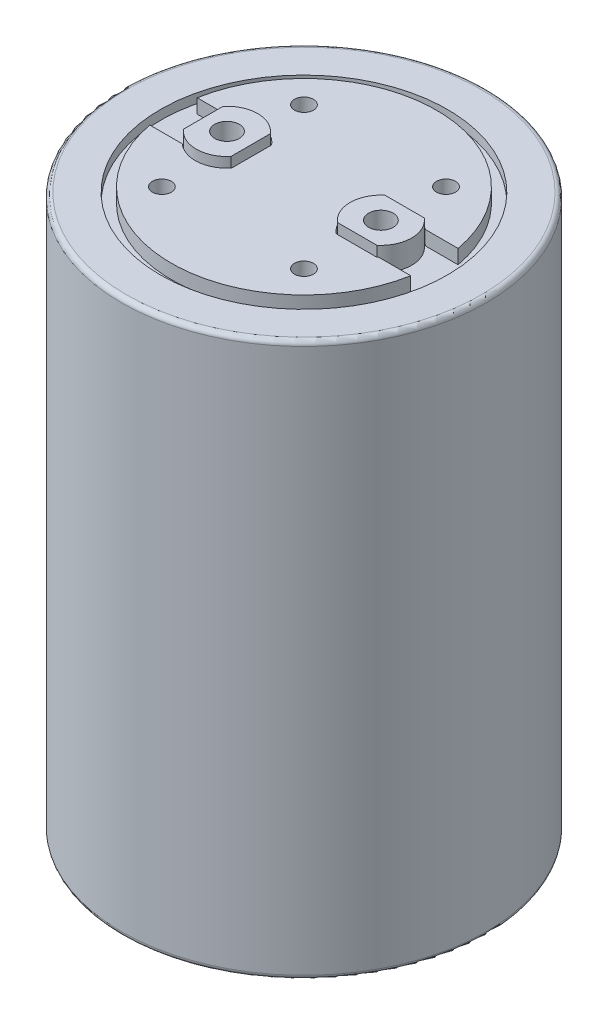
ISO-10303-21;
HEADER;
FILE_DESCRIPTION(('STEP AP214'),'2;1');
FILE_NAME('part.step','',(''),(''),'','','');
FILE_SCHEMA(('AUTOMOTIVE_DESIGN { 1 0 10303 214 1 1 1 1 }'));
ENDSEC;
DATA;
#1=APPLICATION_CONTEXT('core data for automotive mechanical design processes');
#2=APPLICATION_PROTOCOL_DEFINITION('international standard','automotive_design',2000,#1);
#3=PRODUCT_CONTEXT('',#1,'mechanical');
#4=PRODUCT('Part','Part','',(#3));
#5=PRODUCT_RELATED_PRODUCT_CATEGORY('part','',(#4));
#6=PRODUCT_DEFINITION_FORMATION('','',#4);
#7=PRODUCT_DEFINITION_CONTEXT('part definition',#1,'design');
#8=PRODUCT_DEFINITION('design','',#6,#7);
#9=PRODUCT_DEFINITION_SHAPE('','',#8);
#10=(LENGTH_UNIT() NAMED_UNIT(*) SI_UNIT(.MILLI.,.METRE.));
#11=(NAMED_UNIT(*) PLANE_ANGLE_UNIT() SI_UNIT($,.RADIAN.));
#12=(NAMED_UNIT(*) SI_UNIT($,.STERADIAN.) SOLID_ANGLE_UNIT());
#13=UNCERTAINTY_MEASURE_WITH_UNIT(LENGTH_MEASURE(1.E-05),#10,'distance_accuracy_value','');
#14=(GEOMETRIC_REPRESENTATION_CONTEXT(3) GLOBAL_UNCERTAINTY_ASSIGNED_CONTEXT((#13)) GLOBAL_UNIT_ASSIGNED_CONTEXT((#10,
#11,#12)) REPRESENTATION_CONTEXT('',''));
#15=CARTESIAN_POINT('',(0.,0.,0.));
#16=DIRECTION('',(0.,0.,1.));
#17=DIRECTION('',(1.,0.,0.));
#18=AXIS2_PLACEMENT_3D('',#15,#16,#17);
#19=CARTESIAN_POINT('',(1.1478244810946,61.4471649497469,37.8154701534106));
#20=DIRECTION('',(0.,-1.,0.));
#21=DIRECTION('',(0.,0.,-1.));
#22=AXIS2_PLACEMENT_3D('',#19,#20,#21);
#23=CYLINDRICAL_SURFACE('',#22,28.);
#24=CARTESIAN_POINT('',(1.1478244810946,58.4471649497469,37.8154701534106));
#25=DIRECTION('',(0.,1.,0.));
#26=DIRECTION('',(0.,0.,1.));
#27=AXIS2_PLACEMENT_3D('',#24,#25,#26);
#28=CIRCLE('',#27,28.);
#29=CARTESIAN_POINT('',(28.6977791090064,58.4471649497469,32.8154701534106));
#30=VERTEX_POINT('',#29);
#31=CARTESIAN_POINT('',(-26.4021301468172,58.4471649497469,32.8154701534106));
#32=VERTEX_POINT('',#31);
#33=EDGE_CURVE('E255',#30,#32,#28,.T.);
#34=ORIENTED_EDGE('',*,*,#33,.T.);
#35=DIRECTION('',(0.,-1.,0.));
#36=VECTOR('',#35,1.);
#37=CARTESIAN_POINT('',(-26.4021301468172,61.4471649497469,32.8154701534106));
#38=LINE('',#37,#36);
#39=CARTESIAN_POINT('',(-26.4021301468172,61.4471649497469,32.8154701534106));
#40=VERTEX_POINT('',#39);
#41=EDGE_CURVE('E181',#32,#40,#38,.F.);
#42=ORIENTED_EDGE('',*,*,#41,.T.);
#43=CARTESIAN_POINT('',(1.1478244810946,61.4471649497469,37.8154701534106));
#44=DIRECTION('',(0.,1.,0.));
#45=DIRECTION('',(0.,0.,1.));
#46=AXIS2_PLACEMENT_3D('',#43,#44,#45);
#47=CIRCLE('',#46,28.);
#48=CARTESIAN_POINT('',(28.6977791090064,61.4471649497469,32.8154701534106));
#49=VERTEX_POINT('',#48);
#50=EDGE_CURVE('E254',#49,#40,#47,.T.);
#51=ORIENTED_EDGE('',*,*,#50,.F.);
#52=DIRECTION('',(0.,-1.,0.));
#53=VECTOR('',#52,1.);
#54=CARTESIAN_POINT('',(28.6977791090064,61.4471649497469,32.8154701534106));
#55=LINE('',#54,#53);
#56=EDGE_CURVE('E293',#49,#30,#55,.T.);
#57=ORIENTED_EDGE('',*,*,#56,.T.);
#58=EDGE_LOOP('',(#34,#42,#51,#57));
#59=FACE_BOUND('',#58,.T.);
#60=ADVANCED_FACE('F47',(#59),#23,.T.);
#61=CARTESIAN_POINT('',(17.3978244810946,61.4471649497469,37.8154701534106));
#62=DIRECTION('',(0.,-1.,0.));
#63=DIRECTION('',(0.,0.,-1.));
#64=AXIS2_PLACEMENT_3D('',#61,#62,#63);
#65=CYLINDRICAL_SURFACE('',#64,6.7);
#66=DIRECTION('',(0.,-1.,0.));
#67=VECTOR('',#66,1.);
#68=CARTESIAN_POINT('',(21.8576451052902,61.4471649497469,42.8154701534106));
#69=LINE('',#68,#67);
#70=CARTESIAN_POINT('',(21.8576451052902,58.4471649497469,42.8154701534106));
#71=VERTEX_POINT('',#70);
#72=CARTESIAN_POINT('',(21.8576451052902,61.4471649497469,42.8154701534106));
#73=VERTEX_POINT('',#72);
#74=EDGE_CURVE('E146',#71,#73,#69,.F.);
#75=ORIENTED_EDGE('',*,*,#74,.F.);
#76=CARTESIAN_POINT('',(17.3978244810946,58.4471649497469,37.8154701534106));
#77=DIRECTION('',(0.,1.,0.));
#78=DIRECTION('',(0.,0.,1.));
#79=AXIS2_PLACEMENT_3D('',#76,#77,#78);
#80=CIRCLE('',#79,6.7);
#81=CARTESIAN_POINT('',(21.6227505159501,58.4471649497469,43.0154701534106));
#82=VERTEX_POINT('',#81);
#83=EDGE_CURVE('E188',#82,#71,#80,.T.);
#84=ORIENTED_EDGE('',*,*,#83,.F.);
#85=DIRECTION('',(0.,-1.,0.));
#86=VECTOR('',#85,1.);
#87=CARTESIAN_POINT('',(21.6227505159501,61.4471649497469,43.0154701534106));
#88=LINE('',#87,#86);
#89=CARTESIAN_POINT('',(21.6227505159501,61.4471649497469,43.0154701534106));
#90=VERTEX_POINT('',#89);
#91=EDGE_CURVE('E173',#90,#82,#88,.T.);
#92=ORIENTED_EDGE('',*,*,#91,.F.);
#93=CARTESIAN_POINT('',(17.3978244810946,61.4471649497469,37.8154701534106));
#94=DIRECTION('',(0.,1.,0.));
#95=DIRECTION('',(0.,0.,1.));
#96=AXIS2_PLACEMENT_3D('',#93,#94,#95);
#97=CIRCLE('',#96,6.7);
#98=EDGE_CURVE('E165',#90,#73,#97,.T.);
#99=ORIENTED_EDGE('',*,*,#98,.T.);
#100=EDGE_LOOP('',(#75,#84,#92,#99));
#101=FACE_BOUND('',#100,.T.);
#102=ADVANCED_FACE('F171',(#101),#65,.F.);
#103=CARTESIAN_POINT('',(1.1478244810946,61.4471649497469,37.8154701534106));
#104=DIRECTION('',(0.,1.,0.));
#105=DIRECTION('',(0.,0.,1.));
#106=AXIS2_PLACEMENT_3D('',#103,#104,#105);
#107=PLANE('',#106);
#108=DIRECTION('',(-1.,0.,0.));
#109=VECTOR('',#108,1.);
#110=CARTESIAN_POINT('',(-26.8521755189054,61.4471649497469,32.8154701534106));
#111=LINE('',#110,#109);
#112=CARTESIAN_POINT('',(-19.5619961431009,61.4471649497469,32.8154701534106));
#113=VERTEX_POINT('',#112);
#114=EDGE_CURVE('E285',#113,#40,#111,.T.);
#115=ORIENTED_EDGE('',*,*,#114,.F.);
#116=CARTESIAN_POINT('',(-15.1021755189054,61.4471649497469,37.8154701534106));
#117=DIRECTION('',(0.,1.,0.));
#118=DIRECTION('',(0.,0.,1.));
#119=AXIS2_PLACEMENT_3D('',#116,#117,#118);
#120=CIRCLE('',#119,6.69999999999999);
#121=CARTESIAN_POINT('',(-9.9021755189054,61.4471649497469,33.5905441185551));
#122=VERTEX_POINT('',#121);
#123=EDGE_CURVE('E208',#122,#113,#120,.T.);
#124=ORIENTED_EDGE('',*,*,#123,.F.);
#125=DIRECTION('',(0.,0.,-1.));
#126=VECTOR('',#125,1.);
#127=CARTESIAN_POINT('',(-9.9021755189054,61.4471649497469,42.0403961882661));
#128=LINE('',#127,#126);
#129=CARTESIAN_POINT('',(-9.9021755189054,61.4471649497469,42.0403961882661));
#130=VERTEX_POINT('',#129);
#131=EDGE_CURVE('E214',#130,#122,#128,.T.);
#132=ORIENTED_EDGE('',*,*,#131,.F.);
#133=CARTESIAN_POINT('',(-15.1021755189054,61.4471649497469,37.8154701534106));
#134=DIRECTION('',(0.,1.,0.));
#135=DIRECTION('',(0.,0.,1.));
#136=AXIS2_PLACEMENT_3D('',#133,#134,#135);
#137=CIRCLE('',#136,6.7);
#138=CARTESIAN_POINT('',(-19.561996143101,61.4471649497469,42.8154701534106));
#139=VERTEX_POINT('',#138);
#140=EDGE_CURVE('E211',#139,#130,#137,.T.);
#141=ORIENTED_EDGE('',*,*,#140,.F.);
#142=DIRECTION('',(1.,0.,0.));
#143=VECTOR('',#142,1.);
#144=CARTESIAN_POINT('',(-15.1021755189054,61.4471649497469,42.8154701534106));
#145=LINE('',#144,#143);
#146=CARTESIAN_POINT('',(-26.4021301468172,61.4471649497469,42.8154701534106));
#147=VERTEX_POINT('',#146);
#148=EDGE_CURVE('E69',#147,#139,#145,.T.);
#149=ORIENTED_EDGE('',*,*,#148,.F.);
#150=CARTESIAN_POINT('',(28.6977791090064,61.4471649497469,42.8154701534106));
#151=VERTEX_POINT('',#150);
#152=EDGE_CURVE('E167',#147,#151,#47,.T.);
#153=ORIENTED_EDGE('',*,*,#152,.T.);
#154=DIRECTION('',(1.,0.,0.));
#155=VECTOR('',#154,1.);
#156=CARTESIAN_POINT('',(29.1478244810946,61.4471649497469,42.8154701534106));
#157=LINE('',#156,#155);
#158=EDGE_CURVE('E149',#73,#151,#157,.T.);
#159=ORIENTED_EDGE('',*,*,#158,.F.);
#160=ORIENTED_EDGE('',*,*,#98,.F.);
#161=DIRECTION('',(1.,0.,0.));
#162=VECTOR('',#161,1.);
#163=CARTESIAN_POINT('',(13.1728984462391,61.4471649497469,43.0154701534106));
#164=LINE('',#163,#162);
#165=CARTESIAN_POINT('',(13.1728984462391,61.4471649497469,43.0154701534106));
#166=VERTEX_POINT('',#165);
#167=EDGE_CURVE('E186',#166,#90,#164,.T.);
#168=ORIENTED_EDGE('',*,*,#167,.F.);
#169=CARTESIAN_POINT('',(17.3978244810946,61.4471649497469,37.8154701534106));
#170=DIRECTION('',(0.,1.,0.));
#171=DIRECTION('',(0.,0.,1.));
#172=AXIS2_PLACEMENT_3D('',#169,#170,#171);
#173=CIRCLE('',#172,6.70000000000001);
#174=CARTESIAN_POINT('',(13.1728984462391,61.4471649497469,32.6154701534106));
#175=VERTEX_POINT('',#174);
#176=EDGE_CURVE('E177',#175,#166,#173,.T.);
#177=ORIENTED_EDGE('',*,*,#176,.F.);
#178=DIRECTION('',(-1.,0.,0.));
#179=VECTOR('',#178,1.);
#180=CARTESIAN_POINT('',(21.6227505159501,61.4471649497469,32.6154701534106));
#181=LINE('',#180,#179);
#182=CARTESIAN_POINT('',(21.6227505159501,61.4471649497469,32.6154701534106));
#183=VERTEX_POINT('',#182);
#184=EDGE_CURVE('E174',#183,#175,#181,.T.);
#185=ORIENTED_EDGE('',*,*,#184,.F.);
#186=CARTESIAN_POINT('',(21.8576451052902,61.4471649497469,32.8154701534106));
#187=VERTEX_POINT('',#186);
#188=EDGE_CURVE('E175',#187,#183,#97,.T.);
#189=ORIENTED_EDGE('',*,*,#188,.F.);
#190=DIRECTION('',(-1.,0.,0.));
#191=VECTOR('',#190,1.);
#192=CARTESIAN_POINT('',(17.3978244810946,61.4471649497469,32.8154701534106));
#193=LINE('',#192,#191);
#194=EDGE_CURVE('E168',#49,#187,#193,.T.);
#195=ORIENTED_EDGE('',*,*,#194,.F.);
#196=ORIENTED_EDGE('',*,*,#50,.T.);
#197=EDGE_LOOP('',(#115,#124,#132,#141,#149,#153,#159,#160,#168,#177,#185,#189,#195,#196));
#198=FACE_BOUND('',#197,.T.);
#199=CARTESIAN_POINT('',(16.1478244810946,61.4471649497469,22.8154701534106));
#200=DIRECTION('',(0.,1.,0.));
#201=DIRECTION('',(0.,0.,1.));
#202=AXIS2_PLACEMENT_3D('',#199,#200,#201);
#203=CIRCLE('',#202,2.);
#204=CARTESIAN_POINT('',(16.1478244810946,61.4471649497469,24.8154701534106));
#205=VERTEX_POINT('',#204);
#206=EDGE_CURVE('E235',#205,#205,#203,.T.);
#207=ORIENTED_EDGE('',*,*,#206,.F.);
#208=EDGE_LOOP('',(#207));
#209=FACE_BOUND('',#208,.T.);
#210=CARTESIAN_POINT('',(-13.8521755189054,61.4471649497469,22.8154701534106));
#211=DIRECTION('',(0.,1.,0.));
#212=DIRECTION('',(0.,0.,-1.));
#213=AXIS2_PLACEMENT_3D('',#210,#211,#212);
#214=CIRCLE('',#213,2.);
#215=CARTESIAN_POINT('',(-13.8521755189054,61.4471649497469,20.8154701534106));
#216=VERTEX_POINT('',#215);
#217=EDGE_CURVE('E247',#216,#216,#214,.T.);
#218=ORIENTED_EDGE('',*,*,#217,.F.);
#219=EDGE_LOOP('',(#218));
#220=FACE_BOUND('',#219,.T.);
#221=CARTESIAN_POINT('',(16.1478244810946,61.4471649497469,52.8154701534106));
#222=DIRECTION('',(0.,1.,0.));
#223=DIRECTION('',(0.,0.,1.));
#224=AXIS2_PLACEMENT_3D('',#221,#222,#223);
#225=CIRCLE('',#224,2.);
#226=CARTESIAN_POINT('',(16.1478244810946,61.4471649497469,54.8154701534106));
#227=VERTEX_POINT('',#226);
#228=EDGE_CURVE('E241',#227,#227,#225,.T.);
#229=ORIENTED_EDGE('',*,*,#228,.F.);
#230=EDGE_LOOP('',(#229));
#231=FACE_BOUND('',#230,.T.);
#232=CARTESIAN_POINT('',(-13.8521755189054,61.4471649497469,52.8154701534106));
#233=DIRECTION('',(0.,1.,0.));
#234=DIRECTION('',(0.,0.,-1.));
#235=AXIS2_PLACEMENT_3D('',#232,#233,#234);
#236=CIRCLE('',#235,2.);
#237=CARTESIAN_POINT('',(-13.8521755189054,61.4471649497469,50.8154701534106));
#238=VERTEX_POINT('',#237);
#239=EDGE_CURVE('E229',#238,#238,#236,.T.);
#240=ORIENTED_EDGE('',*,*,#239,.F.);
#241=EDGE_LOOP('',(#240));
#242=FACE_BOUND('',#241,.T.);
#243=ADVANCED_FACE('F162',(#198,#209,#220,#231,#242),#107,.T.);
#244=CARTESIAN_POINT('',(1.1478244810946,58.4471649497469,37.8154701534106));
#245=DIRECTION('',(0.,1.,0.));
#246=DIRECTION('',(0.,0.,1.));
#247=AXIS2_PLACEMENT_3D('',#244,#245,#246);
#248=PLANE('',#247);
#249=CARTESIAN_POINT('',(-15.1021755189054,58.4471649497469,37.8154701534106));
#250=DIRECTION('',(0.,1.,0.));
#251=DIRECTION('',(0.,0.,1.));
#252=AXIS2_PLACEMENT_3D('',#249,#250,#251);
#253=CIRCLE('',#252,6.69999999999999);
#254=CARTESIAN_POINT('',(-9.9021755189054,58.4471649497469,33.5905441185551));
#255=VERTEX_POINT('',#254);
#256=CARTESIAN_POINT('',(-19.5619961431009,58.4471649497469,32.8154701534106));
#257=VERTEX_POINT('',#256);
#258=EDGE_CURVE('E207',#255,#257,#253,.T.);
#259=ORIENTED_EDGE('',*,*,#258,.T.);
#260=DIRECTION('',(-1.,0.,0.));
#261=VECTOR('',#260,1.);
#262=CARTESIAN_POINT('',(1.1478244810946,58.4471649497469,32.8154701534106));
#263=LINE('',#262,#261);
#264=EDGE_CURVE('E61',#257,#32,#263,.T.);
#265=ORIENTED_EDGE('',*,*,#264,.T.);
#266=ORIENTED_EDGE('',*,*,#33,.F.);
#267=DIRECTION('',(-1.,0.,0.));
#268=VECTOR('',#267,1.);
#269=CARTESIAN_POINT('',(1.1478244810946,58.4471649497469,32.8154701534106));
#270=LINE('',#269,#268);
#271=CARTESIAN_POINT('',(21.8576451052902,58.4471649497469,32.8154701534106));
#272=VERTEX_POINT('',#271);
#273=EDGE_CURVE('E290',#30,#272,#270,.T.);
#274=ORIENTED_EDGE('',*,*,#273,.T.);
#275=CARTESIAN_POINT('',(21.6227505159501,58.4471649497469,32.6154701534106));
#276=VERTEX_POINT('',#275);
#277=EDGE_CURVE('E191',#272,#276,#80,.T.);
#278=ORIENTED_EDGE('',*,*,#277,.T.);
#279=DIRECTION('',(-1.,0.,0.));
#280=VECTOR('',#279,1.);
#281=CARTESIAN_POINT('',(21.6227505159501,58.4471649497469,32.6154701534106));
#282=LINE('',#281,#280);
#283=CARTESIAN_POINT('',(13.1728984462391,58.4471649497469,32.6154701534106));
#284=VERTEX_POINT('',#283);
#285=EDGE_CURVE('E190',#276,#284,#282,.T.);
#286=ORIENTED_EDGE('',*,*,#285,.T.);
#287=CARTESIAN_POINT('',(17.3978244810946,58.4471649497469,37.8154701534106));
#288=DIRECTION('',(0.,1.,0.));
#289=DIRECTION('',(0.,0.,1.));
#290=AXIS2_PLACEMENT_3D('',#287,#288,#289);
#291=CIRCLE('',#290,6.70000000000001);
#292=CARTESIAN_POINT('',(13.1728984462391,58.4471649497469,43.0154701534106));
#293=VERTEX_POINT('',#292);
#294=EDGE_CURVE('E194',#284,#293,#291,.T.);
#295=ORIENTED_EDGE('',*,*,#294,.T.);
#296=DIRECTION('',(1.,0.,0.));
#297=VECTOR('',#296,1.);
#298=CARTESIAN_POINT('',(13.1728984462391,58.4471649497469,43.0154701534106));
#299=LINE('',#298,#297);
#300=EDGE_CURVE('E179',#293,#82,#299,.T.);
#301=ORIENTED_EDGE('',*,*,#300,.T.);
#302=ORIENTED_EDGE('',*,*,#83,.T.);
#303=DIRECTION('',(1.,0.,0.));
#304=VECTOR('',#303,1.);
#305=CARTESIAN_POINT('',(1.1478244810946,58.4471649497469,42.8154701534106));
#306=LINE('',#305,#304);
#307=CARTESIAN_POINT('',(28.6977791090064,58.4471649497469,42.8154701534106));
#308=VERTEX_POINT('',#307);
#309=EDGE_CURVE('E152',#71,#308,#306,.T.);
#310=ORIENTED_EDGE('',*,*,#309,.T.);
#311=CARTESIAN_POINT('',(-26.4021301468172,58.4471649497469,42.8154701534106));
#312=VERTEX_POINT('',#311);
#313=EDGE_CURVE('E250',#312,#308,#28,.T.);
#314=ORIENTED_EDGE('',*,*,#313,.F.);
#315=DIRECTION('',(1.,0.,0.));
#316=VECTOR('',#315,1.);
#317=CARTESIAN_POINT('',(1.1478244810946,58.4471649497469,42.8154701534106));
#318=LINE('',#317,#316);
#319=CARTESIAN_POINT('',(-19.5619961431009,58.4471649497469,42.8154701534106));
#320=VERTEX_POINT('',#319);
#321=EDGE_CURVE('E260',#312,#320,#318,.T.);
#322=ORIENTED_EDGE('',*,*,#321,.T.);
#323=CARTESIAN_POINT('',(-15.1021755189054,58.4471649497469,37.8154701534106));
#324=DIRECTION('',(0.,1.,0.));
#325=DIRECTION('',(0.,0.,1.));
#326=AXIS2_PLACEMENT_3D('',#323,#324,#325);
#327=CIRCLE('',#326,6.7);
#328=CARTESIAN_POINT('',(-9.9021755189054,58.4471649497469,42.0403961882661));
#329=VERTEX_POINT('',#328);
#330=EDGE_CURVE('E219',#320,#329,#327,.T.);
#331=ORIENTED_EDGE('',*,*,#330,.T.);
#332=DIRECTION('',(0.,0.,-1.));
#333=VECTOR('',#332,1.);
#334=CARTESIAN_POINT('',(-9.9021755189054,58.4471649497469,42.0403961882661));
#335=LINE('',#334,#333);
#336=EDGE_CURVE('E212',#329,#255,#335,.T.);
#337=ORIENTED_EDGE('',*,*,#336,.T.);
#338=EDGE_LOOP('',(#259,#265,#266,#274,#278,#286,#295,#301,#302,#310,#314,#322,#331,#337));
#339=FACE_BOUND('',#338,.T.);
#340=CARTESIAN_POINT('',(-13.8521755189054,58.4471649497469,22.8154701534106));
#341=DIRECTION('',(0.,1.,0.));
#342=DIRECTION('',(0.,0.,-1.));
#343=AXIS2_PLACEMENT_3D('',#340,#341,#342);
#344=CIRCLE('',#343,2.);
#345=CARTESIAN_POINT('',(-13.8521755189054,58.4471649497469,20.8154701534106));
#346=VERTEX_POINT('',#345);
#347=EDGE_CURVE('E244',#346,#346,#344,.T.);
#348=ORIENTED_EDGE('',*,*,#347,.T.);
#349=EDGE_LOOP('',(#348));
#350=FACE_BOUND('',#349,.T.);
#351=CARTESIAN_POINT('',(16.1478244810946,58.4471649497469,52.8154701534106));
#352=DIRECTION('',(0.,1.,0.));
#353=DIRECTION('',(0.,0.,1.));
#354=AXIS2_PLACEMENT_3D('',#351,#352,#353);
#355=CIRCLE('',#354,2.);
#356=CARTESIAN_POINT('',(16.1478244810946,58.4471649497469,54.8154701534106));
#357=VERTEX_POINT('',#356);
#358=EDGE_CURVE('E238',#357,#357,#355,.T.);
#359=ORIENTED_EDGE('',*,*,#358,.T.);
#360=EDGE_LOOP('',(#359));
#361=FACE_BOUND('',#360,.T.);
#362=CARTESIAN_POINT('',(16.1478244810946,58.4471649497469,22.8154701534106));
#363=DIRECTION('',(0.,1.,0.));
#364=DIRECTION('',(0.,0.,1.));
#365=AXIS2_PLACEMENT_3D('',#362,#363,#364);
#366=CIRCLE('',#365,2.);
#367=CARTESIAN_POINT('',(16.1478244810946,58.4471649497469,24.8154701534106));
#368=VERTEX_POINT('',#367);
#369=EDGE_CURVE('E232',#368,#368,#366,.T.);
#370=ORIENTED_EDGE('',*,*,#369,.T.);
#371=EDGE_LOOP('',(#370));
#372=FACE_BOUND('',#371,.T.);
#373=CARTESIAN_POINT('',(-13.8521755189054,58.4471649497469,52.8154701534106));
#374=DIRECTION('',(0.,1.,0.));
#375=DIRECTION('',(0.,0.,-1.));
#376=AXIS2_PLACEMENT_3D('',#373,#374,#375);
#377=CIRCLE('',#376,2.);
#378=CARTESIAN_POINT('',(-13.8521755189054,58.4471649497469,50.8154701534106));
#379=VERTEX_POINT('',#378);
#380=EDGE_CURVE('E228',#379,#379,#377,.T.);
#381=ORIENTED_EDGE('',*,*,#380,.T.);
#382=EDGE_LOOP('',(#381));
#383=FACE_BOUND('',#382,.T.);
#384=ADVANCED_FACE('F267',(#339,#350,#361,#372,#383),#248,.F.);
#385=ORIENTED_EDGE('',*,*,#152,.F.);
#386=DIRECTION('',(0.,-1.,0.));
#387=VECTOR('',#386,1.);
#388=CARTESIAN_POINT('',(-26.4021301468172,61.4471649497469,42.8154701534106));
#389=LINE('',#388,#387);
#390=EDGE_CURVE('E269',#147,#312,#389,.T.);
#391=ORIENTED_EDGE('',*,*,#390,.T.);
#392=ORIENTED_EDGE('',*,*,#313,.T.);
#393=DIRECTION('',(0.,-1.,0.));
#394=VECTOR('',#393,1.);
#395=CARTESIAN_POINT('',(28.6977791090064,61.4471649497469,42.8154701534106));
#396=LINE('',#395,#394);
#397=EDGE_CURVE('E270',#308,#151,#396,.F.);
#398=ORIENTED_EDGE('',*,*,#397,.T.);
#399=EDGE_LOOP('',(#385,#391,#392,#398));
#400=FACE_BOUND('',#399,.T.);
#401=ADVANCED_FACE('F49',(#400),#23,.T.);
#402=CARTESIAN_POINT('',(-13.8521755189054,61.4471649497469,22.8154701534106));
#403=DIRECTION('',(0.,-1.,0.));
#404=DIRECTION('',(0.,0.,-1.));
#405=AXIS2_PLACEMENT_3D('',#402,#403,#404);
#406=CYLINDRICAL_SURFACE('',#405,2.);
#407=ORIENTED_EDGE('',*,*,#217,.T.);
#408=EDGE_LOOP('',(#407));
#409=FACE_BOUND('',#408,.T.);
#410=ORIENTED_EDGE('',*,*,#347,.F.);
#411=EDGE_LOOP('',(#410));
#412=FACE_BOUND('',#411,.T.);
#413=ADVANCED_FACE('F338',(#409,#412),#406,.F.);
#414=CARTESIAN_POINT('',(16.1478244810946,61.4471649497469,52.8154701534106));
#415=DIRECTION('',(0.,-1.,0.));
#416=DIRECTION('',(0.,0.,-1.));
#417=AXIS2_PLACEMENT_3D('',#414,#415,#416);
#418=CYLINDRICAL_SURFACE('',#417,2.);
#419=ORIENTED_EDGE('',*,*,#228,.T.);
#420=EDGE_LOOP('',(#419));
#421=FACE_BOUND('',#420,.T.);
#422=ORIENTED_EDGE('',*,*,#358,.F.);
#423=EDGE_LOOP('',(#422));
#424=FACE_BOUND('',#423,.T.);
#425=ADVANCED_FACE('F344',(#421,#424),#418,.F.);
#426=CARTESIAN_POINT('',(16.1478244810946,61.4471649497469,22.8154701534106));
#427=DIRECTION('',(0.,-1.,0.));
#428=DIRECTION('',(0.,0.,-1.));
#429=AXIS2_PLACEMENT_3D('',#426,#427,#428);
#430=CYLINDRICAL_SURFACE('',#429,2.);
#431=ORIENTED_EDGE('',*,*,#206,.T.);
#432=EDGE_LOOP('',(#431));
#433=FACE_BOUND('',#432,.T.);
#434=ORIENTED_EDGE('',*,*,#369,.F.);
#435=EDGE_LOOP('',(#434));
#436=FACE_BOUND('',#435,.T.);
#437=ADVANCED_FACE('F354',(#433,#436),#430,.F.);
#438=CARTESIAN_POINT('',(-13.8521755189054,61.4471649497469,52.8154701534106));
#439=DIRECTION('',(0.,-1.,0.));
#440=DIRECTION('',(0.,0.,-1.));
#441=AXIS2_PLACEMENT_3D('',#438,#439,#440);
#442=CYLINDRICAL_SURFACE('',#441,2.);
#443=ORIENTED_EDGE('',*,*,#239,.T.);
#444=EDGE_LOOP('',(#443));
#445=FACE_BOUND('',#444,.T.);
#446=ORIENTED_EDGE('',*,*,#380,.F.);
#447=EDGE_LOOP('',(#446));
#448=FACE_BOUND('',#447,.T.);
#449=ADVANCED_FACE('F358',(#445,#448),#442,.F.);
#450=CARTESIAN_POINT('',(-15.1021755189054,61.4471649497469,37.8154701534106));
#451=DIRECTION('',(0.,-1.,0.));
#452=DIRECTION('',(0.,0.,-1.));
#453=AXIS2_PLACEMENT_3D('',#450,#451,#452);
#454=CYLINDRICAL_SURFACE('',#453,6.69999999999999);
#455=DIRECTION('',(0.,-1.,0.));
#456=VECTOR('',#455,1.);
#457=CARTESIAN_POINT('',(-19.5619961431009,61.4471649497469,32.8154701534106));
#458=LINE('',#457,#456);
#459=EDGE_CURVE('E12',#257,#113,#458,.F.);
#460=ORIENTED_EDGE('',*,*,#459,.F.);
#461=ORIENTED_EDGE('',*,*,#258,.F.);
#462=DIRECTION('',(0.,-1.,0.));
#463=VECTOR('',#462,1.);
#464=CARTESIAN_POINT('',(-9.9021755189054,61.4471649497469,33.5905441185551));
#465=LINE('',#464,#463);
#466=EDGE_CURVE('E216',#122,#255,#465,.T.);
#467=ORIENTED_EDGE('',*,*,#466,.F.);
#468=ORIENTED_EDGE('',*,*,#123,.T.);
#469=EDGE_LOOP('',(#460,#461,#467,#468));
#470=FACE_BOUND('',#469,.T.);
#471=ADVANCED_FACE('F282',(#470),#454,.F.);
#472=CARTESIAN_POINT('',(-15.1021755189054,61.4471649497469,37.8154701534106));
#473=DIRECTION('',(0.,-1.,0.));
#474=DIRECTION('',(0.,0.,-1.));
#475=AXIS2_PLACEMENT_3D('',#472,#473,#474);
#476=CYLINDRICAL_SURFACE('',#475,6.7);
#477=DIRECTION('',(0.,-1.,0.));
#478=VECTOR('',#477,1.);
#479=CARTESIAN_POINT('',(-19.5619961431009,61.4471649497469,42.8154701534106));
#480=LINE('',#479,#478);
#481=EDGE_CURVE('E55',#139,#320,#480,.T.);
#482=ORIENTED_EDGE('',*,*,#481,.F.);
#483=ORIENTED_EDGE('',*,*,#140,.T.);
#484=DIRECTION('',(0.,-1.,0.));
#485=VECTOR('',#484,1.);
#486=CARTESIAN_POINT('',(-9.9021755189054,61.4471649497469,42.0403961882661));
#487=LINE('',#486,#485);
#488=EDGE_CURVE('E225',#130,#329,#487,.T.);
#489=ORIENTED_EDGE('',*,*,#488,.T.);
#490=ORIENTED_EDGE('',*,*,#330,.F.);
#491=EDGE_LOOP('',(#482,#483,#489,#490));
#492=FACE_BOUND('',#491,.T.);
#493=ADVANCED_FACE('F272',(#492),#476,.F.);
#494=CARTESIAN_POINT('',(-9.9021755189054,61.4471649497469,42.0403961882661));
#495=DIRECTION('',(-1.,0.,0.));
#496=DIRECTION('',(0.,0.,1.));
#497=AXIS2_PLACEMENT_3D('',#494,#495,#496);
#498=PLANE('',#497);
#499=ORIENTED_EDGE('',*,*,#336,.F.);
#500=ORIENTED_EDGE('',*,*,#488,.F.);
#501=ORIENTED_EDGE('',*,*,#131,.T.);
#502=ORIENTED_EDGE('',*,*,#466,.T.);
#503=EDGE_LOOP('',(#499,#500,#501,#502));
#504=FACE_BOUND('',#503,.T.);
#505=ADVANCED_FACE('F277',(#504),#498,.T.);
#506=DIRECTION('',(0.,-1.,0.));
#507=VECTOR('',#506,1.);
#508=CARTESIAN_POINT('',(21.8576451052902,61.4471649497469,32.8154701534106));
#509=LINE('',#508,#507);
#510=EDGE_CURVE('E156',#187,#272,#509,.T.);
#511=ORIENTED_EDGE('',*,*,#510,.F.);
#512=ORIENTED_EDGE('',*,*,#188,.T.);
#513=DIRECTION('',(0.,-1.,0.));
#514=VECTOR('',#513,1.);
#515=CARTESIAN_POINT('',(21.6227505159501,61.4471649497469,32.6154701534106));
#516=LINE('',#515,#514);
#517=EDGE_CURVE('E204',#183,#276,#516,.T.);
#518=ORIENTED_EDGE('',*,*,#517,.T.);
#519=ORIENTED_EDGE('',*,*,#277,.F.);
#520=EDGE_LOOP('',(#511,#512,#518,#519));
#521=FACE_BOUND('',#520,.T.);
#522=ADVANCED_FACE('F313',(#521),#65,.F.);
#523=CARTESIAN_POINT('',(21.6227505159501,61.4471649497469,32.6154701534106));
#524=DIRECTION('',(0.,0.,1.));
#525=DIRECTION('',(1.,0.,0.));
#526=AXIS2_PLACEMENT_3D('',#523,#524,#525);
#527=PLANE('',#526);
#528=ORIENTED_EDGE('',*,*,#285,.F.);
#529=ORIENTED_EDGE('',*,*,#517,.F.);
#530=ORIENTED_EDGE('',*,*,#184,.T.);
#531=DIRECTION('',(0.,-1.,0.));
#532=VECTOR('',#531,1.);
#533=CARTESIAN_POINT('',(13.1728984462391,61.4471649497469,32.6154701534106));
#534=LINE('',#533,#532);
#535=EDGE_CURVE('E202',#175,#284,#534,.T.);
#536=ORIENTED_EDGE('',*,*,#535,.T.);
#537=EDGE_LOOP('',(#528,#529,#530,#536));
#538=FACE_BOUND('',#537,.T.);
#539=ADVANCED_FACE('F309',(#538),#527,.T.);
#540=CARTESIAN_POINT('',(17.3978244810946,61.4471649497469,37.8154701534106));
#541=DIRECTION('',(0.,-1.,0.));
#542=DIRECTION('',(0.,0.,-1.));
#543=AXIS2_PLACEMENT_3D('',#540,#541,#542);
#544=CYLINDRICAL_SURFACE('',#543,6.70000000000001);
#545=ORIENTED_EDGE('',*,*,#294,.F.);
#546=ORIENTED_EDGE('',*,*,#535,.F.);
#547=ORIENTED_EDGE('',*,*,#176,.T.);
#548=DIRECTION('',(0.,-1.,0.));
#549=VECTOR('',#548,1.);
#550=CARTESIAN_POINT('',(13.1728984462391,61.4471649497469,43.0154701534106));
#551=LINE('',#550,#549);
#552=EDGE_CURVE('E200',#166,#293,#551,.T.);
#553=ORIENTED_EDGE('',*,*,#552,.T.);
#554=EDGE_LOOP('',(#545,#546,#547,#553));
#555=FACE_BOUND('',#554,.T.);
#556=ADVANCED_FACE('F317',(#555),#544,.F.);
#557=CARTESIAN_POINT('',(13.1728984462391,61.4471649497469,43.0154701534106));
#558=DIRECTION('',(0.,0.,-1.));
#559=DIRECTION('',(-1.,0.,0.));
#560=AXIS2_PLACEMENT_3D('',#557,#558,#559);
#561=PLANE('',#560);
#562=ORIENTED_EDGE('',*,*,#300,.F.);
#563=ORIENTED_EDGE('',*,*,#552,.F.);
#564=ORIENTED_EDGE('',*,*,#167,.T.);
#565=ORIENTED_EDGE('',*,*,#91,.T.);
#566=EDGE_LOOP('',(#562,#563,#564,#565));
#567=FACE_BOUND('',#566,.T.);
#568=ADVANCED_FACE('F320',(#567),#561,.T.);
#569=CARTESIAN_POINT('',(17.3978244810946,-56.5528350502531,32.8154701534106));
#570=DIRECTION('',(0.,0.,-1.));
#571=DIRECTION('',(-1.,0.,0.));
#572=AXIS2_PLACEMENT_3D('',#569,#570,#571);
#573=PLANE('',#572);
#574=ORIENTED_EDGE('',*,*,#194,.T.);
#575=ORIENTED_EDGE('',*,*,#510,.T.);
#576=ORIENTED_EDGE('',*,*,#273,.F.);
#577=ORIENTED_EDGE('',*,*,#56,.F.);
#578=EDGE_LOOP('',(#574,#575,#576,#577));
#579=FACE_BOUND('',#578,.T.);
#580=ADVANCED_FACE('F322',(#579),#573,.F.);
#581=CARTESIAN_POINT('',(29.1478244810946,-56.5528350502531,42.8154701534106));
#582=DIRECTION('',(0.,0.,1.));
#583=DIRECTION('',(1.,0.,0.));
#584=AXIS2_PLACEMENT_3D('',#581,#582,#583);
#585=PLANE('',#584);
#586=ORIENTED_EDGE('',*,*,#309,.F.);
#587=ORIENTED_EDGE('',*,*,#74,.T.);
#588=ORIENTED_EDGE('',*,*,#158,.T.);
#589=ORIENTED_EDGE('',*,*,#397,.F.);
#590=EDGE_LOOP('',(#586,#587,#588,#589));
#591=FACE_BOUND('',#590,.T.);
#592=ADVANCED_FACE('F148',(#591),#585,.F.);
#593=CARTESIAN_POINT('',(-15.1021755189054,-56.5528350502531,42.8154701534106));
#594=DIRECTION('',(0.,0.,1.));
#595=DIRECTION('',(1.,0.,0.));
#596=AXIS2_PLACEMENT_3D('',#593,#594,#595);
#597=PLANE('',#596);
#598=ORIENTED_EDGE('',*,*,#148,.T.);
#599=ORIENTED_EDGE('',*,*,#481,.T.);
#600=ORIENTED_EDGE('',*,*,#321,.F.);
#601=ORIENTED_EDGE('',*,*,#390,.F.);
#602=EDGE_LOOP('',(#598,#599,#600,#601));
#603=FACE_BOUND('',#602,.T.);
#604=ADVANCED_FACE('F259',(#603),#597,.F.);
#605=CARTESIAN_POINT('',(-26.8521755189054,-56.5528350502531,32.8154701534106));
#606=DIRECTION('',(0.,0.,-1.));
#607=DIRECTION('',(-1.,0.,0.));
#608=AXIS2_PLACEMENT_3D('',#605,#606,#607);
#609=PLANE('',#608);
#610=ORIENTED_EDGE('',*,*,#264,.F.);
#611=ORIENTED_EDGE('',*,*,#459,.T.);
#612=ORIENTED_EDGE('',*,*,#114,.T.);
#613=ORIENTED_EDGE('',*,*,#41,.F.);
#614=EDGE_LOOP('',(#610,#611,#612,#613));
#615=FACE_BOUND('',#614,.T.);
#616=ADVANCED_FACE('F284',(#615),#609,.F.);
#617=CLOSED_SHELL('',(#60,#102,#243,#384,#401,#413,#425,#437,#449,#471,#493,#505,#522,#539,#556,
#568,#580,#592,#604,#616));
#618=MANIFOLD_SOLID_BREP('B2',#617);
#619=CARTESIAN_POINT('',(1.1478244810946,58.4471649497469,37.8154701534106));
#620=DIRECTION('',(0.,1.,0.));
#621=DIRECTION('',(0.,0.,1.));
#622=AXIS2_PLACEMENT_3D('',#619,#620,#621);
#623=PLANE('',#622);
#624=DIRECTION('',(0.,0.,1.));
#625=VECTOR('',#624,1.);
#626=CARTESIAN_POINT('',(-20.1021755189054,58.4471649497469,33.6621582219516));
#627=LINE('',#626,#625);
#628=CARTESIAN_POINT('',(-20.1021755189054,58.4471649497469,33.6621582219516));
#629=VERTEX_POINT('',#628);
#630=CARTESIAN_POINT('',(-20.1021755189054,58.4471649497469,41.9687820848696));
#631=VERTEX_POINT('',#630);
#632=EDGE_CURVE('E622',#629,#631,#627,.T.);
#633=ORIENTED_EDGE('',*,*,#632,.F.);
#634=CARTESIAN_POINT('',(-15.1021755189054,58.4471649497469,37.8154701534106));
#635=DIRECTION('',(0.,1.,0.));
#636=DIRECTION('',(0.,0.,1.));
#637=AXIS2_PLACEMENT_3D('',#634,#635,#636);
#638=CIRCLE('',#637,6.5);
#639=CARTESIAN_POINT('',(-10.1021755189054,58.4471649497469,33.6621582219516));
#640=VERTEX_POINT('',#639);
#641=EDGE_CURVE('E604',#640,#629,#638,.T.);
#642=ORIENTED_EDGE('',*,*,#641,.F.);
#643=DIRECTION('',(0.,0.,-1.));
#644=VECTOR('',#643,1.);
#645=CARTESIAN_POINT('',(-10.1021755189054,58.4471649497469,41.9687820848696));
#646=LINE('',#645,#644);
#647=CARTESIAN_POINT('',(-10.1021755189054,58.4471649497469,41.9687820848696));
#648=VERTEX_POINT('',#647);
#649=EDGE_CURVE('E613',#648,#640,#646,.T.);
#650=ORIENTED_EDGE('',*,*,#649,.F.);
#651=CARTESIAN_POINT('',(-15.1021755189054,58.4471649497469,37.8154701534106));
#652=DIRECTION('',(0.,1.,0.));
#653=DIRECTION('',(0.,0.,-1.));
#654=AXIS2_PLACEMENT_3D('',#651,#652,#653);
#655=CIRCLE('',#654,6.5);
#656=EDGE_CURVE('E624',#631,#648,#655,.T.);
#657=ORIENTED_EDGE('',*,*,#656,.F.);
#658=EDGE_LOOP('',(#633,#642,#650,#657));
#659=FACE_BOUND('',#658,.T.);
#660=DIRECTION('',(-1.,0.,0.));
#661=VECTOR('',#660,1.);
#662=CARTESIAN_POINT('',(13.2445125496356,58.4471649497469,32.8154701534106));
#663=LINE('',#662,#661);
#664=CARTESIAN_POINT('',(21.5511364125536,58.4471649497469,32.8154701534106));
#665=VERTEX_POINT('',#664);
#666=CARTESIAN_POINT('',(13.2445125496356,58.4471649497469,32.8154701534106));
#667=VERTEX_POINT('',#666);
#668=EDGE_CURVE('E688',#665,#667,#663,.T.);
#669=ORIENTED_EDGE('',*,*,#668,.F.);
#670=CARTESIAN_POINT('',(17.3978244810946,58.4471649497469,37.8154701534106));
#671=DIRECTION('',(0.,1.,0.));
#672=DIRECTION('',(0.,0.,-1.));
#673=AXIS2_PLACEMENT_3D('',#670,#671,#672);
#674=CIRCLE('',#673,6.5);
#675=CARTESIAN_POINT('',(21.5511364125536,58.4471649497469,42.8154701534106));
#676=VERTEX_POINT('',#675);
#677=EDGE_CURVE('E599',#676,#665,#674,.T.);
#678=ORIENTED_EDGE('',*,*,#677,.F.);
#679=DIRECTION('',(1.,0.,0.));
#680=VECTOR('',#679,1.);
#681=CARTESIAN_POINT('',(21.5511364125536,58.4471649497469,42.8154701534106));
#682=LINE('',#681,#680);
#683=CARTESIAN_POINT('',(13.2445125496356,58.4471649497469,42.8154701534106));
#684=VERTEX_POINT('',#683);
#685=EDGE_CURVE('E595',#684,#676,#682,.T.);
#686=ORIENTED_EDGE('',*,*,#685,.F.);
#687=CARTESIAN_POINT('',(17.3978244810946,58.4471649497469,37.8154701534106));
#688=DIRECTION('',(0.,1.,0.));
#689=DIRECTION('',(0.,0.,1.));
#690=AXIS2_PLACEMENT_3D('',#687,#688,#689);
#691=CIRCLE('',#690,6.50000000000001);
#692=EDGE_CURVE('E690',#667,#684,#691,.T.);
#693=ORIENTED_EDGE('',*,*,#692,.F.);
#694=EDGE_LOOP('',(#669,#678,#686,#693));
#695=FACE_BOUND('',#694,.T.);
#696=CARTESIAN_POINT('',(1.1478244810946,58.4471649497469,37.8154701534106));
#697=DIRECTION('',(0.,1.,0.));
#698=DIRECTION('',(0.,0.,1.));
#699=AXIS2_PLACEMENT_3D('',#696,#697,#698);
#700=CIRCLE('',#699,30.3);
#701=CARTESIAN_POINT('',(1.1478244810946,58.4471649497469,68.1154701534106));
#702=VERTEX_POINT('',#701);
#703=EDGE_CURVE('E641',#702,#702,#700,.F.);
#704=ORIENTED_EDGE('',*,*,#703,.F.);
#705=EDGE_LOOP('',(#704));
#706=FACE_BOUND('',#705,.T.);
#707=ADVANCED_FACE('F509',(#659,#695,#706),#623,.T.);
#708=CARTESIAN_POINT('',(-15.1021755189054,63.4471649497469,37.8154701534106));
#709=DIRECTION('',(0.,1.,0.));
#710=DIRECTION('',(0.,0.,1.));
#711=AXIS2_PLACEMENT_3D('',#708,#709,#710);
#712=PLANE('',#711);
#713=CARTESIAN_POINT('',(-15.1021755189054,63.4471649497469,37.8154701534106));
#714=DIRECTION('',(0.,1.,0.));
#715=DIRECTION('',(0.,0.,1.));
#716=AXIS2_PLACEMENT_3D('',#713,#714,#715);
#717=CIRCLE('',#716,6.5);
#718=CARTESIAN_POINT('',(-10.1021755189054,63.4471649497469,33.6621582219516));
#719=VERTEX_POINT('',#718);
#720=CARTESIAN_POINT('',(-20.1021755189054,63.4471649497469,33.6621582219516));
#721=VERTEX_POINT('',#720);
#722=EDGE_CURVE('E609',#719,#721,#717,.T.);
#723=ORIENTED_EDGE('',*,*,#722,.T.);
#724=DIRECTION('',(0.,0.,1.));
#725=VECTOR('',#724,1.);
#726=CARTESIAN_POINT('',(-20.1021755189054,63.4471649497469,33.6621582219516));
#727=LINE('',#726,#725);
#728=CARTESIAN_POINT('',(-20.1021755189054,63.4471649497469,41.9687820848696));
#729=VERTEX_POINT('',#728);
#730=EDGE_CURVE('E612',#721,#729,#727,.T.);
#731=ORIENTED_EDGE('',*,*,#730,.T.);
#732=CARTESIAN_POINT('',(-15.1021755189054,63.4471649497469,37.8154701534106));
#733=DIRECTION('',(0.,1.,0.));
#734=DIRECTION('',(0.,0.,-1.));
#735=AXIS2_PLACEMENT_3D('',#732,#733,#734);
#736=CIRCLE('',#735,6.5);
#737=CARTESIAN_POINT('',(-10.1021755189054,63.4471649497469,41.9687820848696));
#738=VERTEX_POINT('',#737);
#739=EDGE_CURVE('E615',#729,#738,#736,.T.);
#740=ORIENTED_EDGE('',*,*,#739,.T.);
#741=DIRECTION('',(0.,0.,-1.));
#742=VECTOR('',#741,1.);
#743=CARTESIAN_POINT('',(-10.1021755189054,63.4471649497469,41.9687820848696));
#744=LINE('',#743,#742);
#745=EDGE_CURVE('E617',#738,#719,#744,.T.);
#746=ORIENTED_EDGE('',*,*,#745,.T.);
#747=EDGE_LOOP('',(#723,#731,#740,#746));
#748=FACE_BOUND('',#747,.T.);
#749=CARTESIAN_POINT('',(-15.1021755189054,63.4471649497469,37.8154701534106));
#750=DIRECTION('',(0.,1.,0.));
#751=DIRECTION('',(0.,0.,1.));
#752=AXIS2_PLACEMENT_3D('',#749,#750,#751);
#753=CIRCLE('',#752,2.6);
#754=CARTESIAN_POINT('',(-15.1021755189054,63.4471649497469,40.4154701534106));
#755=VERTEX_POINT('',#754);
#756=EDGE_CURVE('E601',#755,#755,#753,.T.);
#757=ORIENTED_EDGE('',*,*,#756,.F.);
#758=EDGE_LOOP('',(#757));
#759=FACE_BOUND('',#758,.T.);
#760=ADVANCED_FACE('F712',(#748,#759),#712,.T.);
#761=CARTESIAN_POINT('',(-15.1021755189054,63.4471649497469,37.8154701534106));
#762=DIRECTION('',(0.,-1.,0.));
#763=DIRECTION('',(0.,0.,-1.));
#764=AXIS2_PLACEMENT_3D('',#761,#762,#763);
#765=CYLINDRICAL_SURFACE('',#764,6.5);
#766=ORIENTED_EDGE('',*,*,#641,.T.);
#767=DIRECTION('',(0.,-1.,0.));
#768=VECTOR('',#767,1.);
#769=CARTESIAN_POINT('',(-20.1021755189054,63.4471649497469,33.6621582219516));
#770=LINE('',#769,#768);
#771=EDGE_CURVE('E633',#721,#629,#770,.T.);
#772=ORIENTED_EDGE('',*,*,#771,.F.);
#773=ORIENTED_EDGE('',*,*,#722,.F.);
#774=DIRECTION('',(0.,-1.,0.));
#775=VECTOR('',#774,1.);
#776=CARTESIAN_POINT('',(-10.1021755189054,63.4471649497469,33.6621582219516));
#777=LINE('',#776,#775);
#778=EDGE_CURVE('E619',#719,#640,#777,.T.);
#779=ORIENTED_EDGE('',*,*,#778,.T.);
#780=EDGE_LOOP('',(#766,#772,#773,#779));
#781=FACE_BOUND('',#780,.T.);
#782=ADVANCED_FACE('F719',(#781),#765,.T.);
#783=CARTESIAN_POINT('',(-20.1021755189054,63.4471649497469,33.6621582219516));
#784=DIRECTION('',(1.,0.,0.));
#785=DIRECTION('',(0.,0.,-1.));
#786=AXIS2_PLACEMENT_3D('',#783,#784,#785);
#787=PLANE('',#786);
#788=ORIENTED_EDGE('',*,*,#632,.T.);
#789=DIRECTION('',(0.,-1.,0.));
#790=VECTOR('',#789,1.);
#791=CARTESIAN_POINT('',(-20.1021755189054,63.4471649497469,41.9687820848696));
#792=LINE('',#791,#790);
#793=EDGE_CURVE('E630',#729,#631,#792,.T.);
#794=ORIENTED_EDGE('',*,*,#793,.F.);
#795=ORIENTED_EDGE('',*,*,#730,.F.);
#796=ORIENTED_EDGE('',*,*,#771,.T.);
#797=EDGE_LOOP('',(#788,#794,#795,#796));
#798=FACE_BOUND('',#797,.T.);
#799=ADVANCED_FACE('F749',(#798),#787,.F.);
#800=CARTESIAN_POINT('',(-15.1021755189054,63.4471649497469,37.8154701534106));
#801=DIRECTION('',(0.,-1.,0.));
#802=DIRECTION('',(0.,0.,-1.));
#803=AXIS2_PLACEMENT_3D('',#800,#801,#802);
#804=CYLINDRICAL_SURFACE('',#803,6.5);
#805=ORIENTED_EDGE('',*,*,#656,.T.);
#806=DIRECTION('',(0.,-1.,0.));
#807=VECTOR('',#806,1.);
#808=CARTESIAN_POINT('',(-10.1021755189054,63.4471649497469,41.9687820848696));
#809=LINE('',#808,#807);
#810=EDGE_CURVE('E532',#738,#648,#809,.T.);
#811=ORIENTED_EDGE('',*,*,#810,.F.);
#812=ORIENTED_EDGE('',*,*,#739,.F.);
#813=ORIENTED_EDGE('',*,*,#793,.T.);
#814=EDGE_LOOP('',(#805,#811,#812,#813));
#815=FACE_BOUND('',#814,.T.);
#816=ADVANCED_FACE('F742',(#815),#804,.T.);
#817=CARTESIAN_POINT('',(-10.1021755189054,63.4471649497469,41.9687820848696));
#818=DIRECTION('',(-1.,0.,0.));
#819=DIRECTION('',(0.,0.,1.));
#820=AXIS2_PLACEMENT_3D('',#817,#818,#819);
#821=PLANE('',#820);
#822=ORIENTED_EDGE('',*,*,#649,.T.);
#823=ORIENTED_EDGE('',*,*,#778,.F.);
#824=ORIENTED_EDGE('',*,*,#745,.F.);
#825=ORIENTED_EDGE('',*,*,#810,.T.);
#826=EDGE_LOOP('',(#822,#823,#824,#825));
#827=FACE_BOUND('',#826,.T.);
#828=ADVANCED_FACE('F734',(#827),#821,.F.);
#829=CARTESIAN_POINT('',(-15.1021755189054,63.4471649497469,37.8154701534106));
#830=DIRECTION('',(0.,-1.,0.));
#831=DIRECTION('',(0.,0.,-1.));
#832=AXIS2_PLACEMENT_3D('',#829,#830,#831);
#833=CYLINDRICAL_SURFACE('',#832,2.6);
#834=ORIENTED_EDGE('',*,*,#756,.T.);
#835=EDGE_LOOP('',(#834));
#836=FACE_BOUND('',#835,.T.);
#837=CARTESIAN_POINT('',(-15.1021755189054,58.4471649497469,37.8154701534106));
#838=DIRECTION('',(0.,1.,0.));
#839=DIRECTION('',(0.,0.,1.));
#840=AXIS2_PLACEMENT_3D('',#837,#838,#839);
#841=CIRCLE('',#840,2.6);
#842=CARTESIAN_POINT('',(-15.1021755189054,58.4471649497469,40.4154701534106));
#843=VERTEX_POINT('',#842);
#844=EDGE_CURVE('E635',#843,#843,#841,.F.);
#845=ORIENTED_EDGE('',*,*,#844,.T.);
#846=EDGE_LOOP('',(#845));
#847=FACE_BOUND('',#846,.T.);
#848=ADVANCED_FACE('F728',(#836,#847),#833,.F.);
#849=ORIENTED_EDGE('',*,*,#844,.F.);
#850=EDGE_LOOP('',(#849));
#851=FACE_BOUND('',#850,.T.);
#852=ADVANCED_FACE('F715',(#851),#623,.T.);
#853=CARTESIAN_POINT('',(17.3978244810946,63.4471649497469,37.8154701534106));
#854=DIRECTION('',(0.,-1.,0.));
#855=DIRECTION('',(0.,0.,-1.));
#856=AXIS2_PLACEMENT_3D('',#853,#854,#855);
#857=PLANE('',#856);
#858=CARTESIAN_POINT('',(17.3978244810946,63.4471649497469,37.8154701534106));
#859=DIRECTION('',(0.,1.,0.));
#860=DIRECTION('',(0.,0.,-1.));
#861=AXIS2_PLACEMENT_3D('',#858,#859,#860);
#862=CIRCLE('',#861,6.5);
#863=CARTESIAN_POINT('',(21.5511364125536,63.4471649497469,42.8154701534106));
#864=VERTEX_POINT('',#863);
#865=CARTESIAN_POINT('',(21.5511364125536,63.4471649497469,32.8154701534106));
#866=VERTEX_POINT('',#865);
#867=EDGE_CURVE('E586',#864,#866,#862,.T.);
#868=ORIENTED_EDGE('',*,*,#867,.T.);
#869=DIRECTION('',(-1.,0.,0.));
#870=VECTOR('',#869,1.);
#871=CARTESIAN_POINT('',(13.2445125496356,63.4471649497469,32.8154701534106));
#872=LINE('',#871,#870);
#873=CARTESIAN_POINT('',(13.2445125496356,63.4471649497469,32.8154701534106));
#874=VERTEX_POINT('',#873);
#875=EDGE_CURVE('E575',#866,#874,#872,.T.);
#876=ORIENTED_EDGE('',*,*,#875,.T.);
#877=CARTESIAN_POINT('',(17.3978244810946,63.4471649497469,37.8154701534106));
#878=DIRECTION('',(0.,1.,0.));
#879=DIRECTION('',(0.,0.,1.));
#880=AXIS2_PLACEMENT_3D('',#877,#878,#879);
#881=CIRCLE('',#880,6.50000000000001);
#882=CARTESIAN_POINT('',(13.2445125496356,63.4471649497469,42.8154701534106));
#883=VERTEX_POINT('',#882);
#884=EDGE_CURVE('E585',#874,#883,#881,.T.);
#885=ORIENTED_EDGE('',*,*,#884,.T.);
#886=DIRECTION('',(1.,0.,0.));
#887=VECTOR('',#886,1.);
#888=CARTESIAN_POINT('',(21.5511364125536,63.4471649497469,42.8154701534106));
#889=LINE('',#888,#887);
#890=EDGE_CURVE('E591',#883,#864,#889,.T.);
#891=ORIENTED_EDGE('',*,*,#890,.T.);
#892=EDGE_LOOP('',(#868,#876,#885,#891));
#893=FACE_BOUND('',#892,.T.);
#894=CARTESIAN_POINT('',(17.3978244810946,63.4471649497469,37.8154701534106));
#895=DIRECTION('',(0.,1.,0.));
#896=DIRECTION('',(0.,0.,1.));
#897=AXIS2_PLACEMENT_3D('',#894,#895,#896);
#898=CIRCLE('',#897,2.6);
#899=CARTESIAN_POINT('',(17.3978244810946,63.4471649497469,40.4154701534106));
#900=VERTEX_POINT('',#899);
#901=EDGE_CURVE('E679',#900,#900,#898,.T.);
#902=ORIENTED_EDGE('',*,*,#901,.F.);
#903=EDGE_LOOP('',(#902));
#904=FACE_BOUND('',#903,.T.);
#905=ADVANCED_FACE('F589',(#893,#904),#857,.F.);
#906=CARTESIAN_POINT('',(17.3978244810946,63.4471649497469,37.8154701534106));
#907=DIRECTION('',(0.,-1.,0.));
#908=DIRECTION('',(0.,0.,-1.));
#909=AXIS2_PLACEMENT_3D('',#906,#907,#908);
#910=CYLINDRICAL_SURFACE('',#909,6.5);
#911=ORIENTED_EDGE('',*,*,#677,.T.);
#912=DIRECTION('',(0.,-1.,0.));
#913=VECTOR('',#912,1.);
#914=CARTESIAN_POINT('',(21.5511364125536,63.4471649497469,32.8154701534106));
#915=LINE('',#914,#913);
#916=EDGE_CURVE('E579',#866,#665,#915,.T.);
#917=ORIENTED_EDGE('',*,*,#916,.F.);
#918=ORIENTED_EDGE('',*,*,#867,.F.);
#919=DIRECTION('',(0.,-1.,0.));
#920=VECTOR('',#919,1.);
#921=CARTESIAN_POINT('',(21.5511364125536,63.4471649497469,42.8154701534106));
#922=LINE('',#921,#920);
#923=EDGE_CURVE('E686',#864,#676,#922,.T.);
#924=ORIENTED_EDGE('',*,*,#923,.T.);
#925=EDGE_LOOP('',(#911,#917,#918,#924));
#926=FACE_BOUND('',#925,.T.);
#927=ADVANCED_FACE('F597',(#926),#910,.T.);
#928=CARTESIAN_POINT('',(13.2445125496356,63.4471649497469,32.8154701534106));
#929=DIRECTION('',(0.,0.,1.));
#930=DIRECTION('',(1.,0.,0.));
#931=AXIS2_PLACEMENT_3D('',#928,#929,#930);
#932=PLANE('',#931);
#933=ORIENTED_EDGE('',*,*,#668,.T.);
#934=DIRECTION('',(0.,-1.,0.));
#935=VECTOR('',#934,1.);
#936=CARTESIAN_POINT('',(13.2445125496356,63.4471649497469,32.8154701534106));
#937=LINE('',#936,#935);
#938=EDGE_CURVE('E582',#874,#667,#937,.T.);
#939=ORIENTED_EDGE('',*,*,#938,.F.);
#940=ORIENTED_EDGE('',*,*,#875,.F.);
#941=ORIENTED_EDGE('',*,*,#916,.T.);
#942=EDGE_LOOP('',(#933,#939,#940,#941));
#943=FACE_BOUND('',#942,.T.);
#944=ADVANCED_FACE('F577',(#943),#932,.F.);
#945=CARTESIAN_POINT('',(17.3978244810946,63.4471649497469,37.8154701534106));
#946=DIRECTION('',(0.,-1.,0.));
#947=DIRECTION('',(0.,0.,-1.));
#948=AXIS2_PLACEMENT_3D('',#945,#946,#947);
#949=CYLINDRICAL_SURFACE('',#948,6.50000000000001);
#950=ORIENTED_EDGE('',*,*,#692,.T.);
#951=DIRECTION('',(0.,-1.,0.));
#952=VECTOR('',#951,1.);
#953=CARTESIAN_POINT('',(13.2445125496356,63.4471649497469,42.8154701534106));
#954=LINE('',#953,#952);
#955=EDGE_CURVE('E524',#883,#684,#954,.T.);
#956=ORIENTED_EDGE('',*,*,#955,.F.);
#957=ORIENTED_EDGE('',*,*,#884,.F.);
#958=ORIENTED_EDGE('',*,*,#938,.T.);
#959=EDGE_LOOP('',(#950,#956,#957,#958));
#960=FACE_BOUND('',#959,.T.);
#961=ADVANCED_FACE('F698',(#960),#949,.T.);
#962=CARTESIAN_POINT('',(21.5511364125536,63.4471649497469,42.8154701534106));
#963=DIRECTION('',(0.,0.,-1.));
#964=DIRECTION('',(-1.,0.,0.));
#965=AXIS2_PLACEMENT_3D('',#962,#963,#964);
#966=PLANE('',#965);
#967=ORIENTED_EDGE('',*,*,#685,.T.);
#968=ORIENTED_EDGE('',*,*,#923,.F.);
#969=ORIENTED_EDGE('',*,*,#890,.F.);
#970=ORIENTED_EDGE('',*,*,#955,.T.);
#971=EDGE_LOOP('',(#967,#968,#969,#970));
#972=FACE_BOUND('',#971,.T.);
#973=ADVANCED_FACE('F699',(#972),#966,.F.);
#974=CARTESIAN_POINT('',(17.3978244810946,63.4471649497469,37.8154701534106));
#975=DIRECTION('',(0.,-1.,0.));
#976=DIRECTION('',(0.,0.,-1.));
#977=AXIS2_PLACEMENT_3D('',#974,#975,#976);
#978=CYLINDRICAL_SURFACE('',#977,2.6);
#979=ORIENTED_EDGE('',*,*,#901,.T.);
#980=EDGE_LOOP('',(#979));
#981=FACE_BOUND('',#980,.T.);
#982=CARTESIAN_POINT('',(17.3978244810946,58.4471649497469,37.8154701534106));
#983=DIRECTION('',(0.,1.,0.));
#984=DIRECTION('',(0.,0.,1.));
#985=AXIS2_PLACEMENT_3D('',#982,#983,#984);
#986=CIRCLE('',#985,2.6);
#987=CARTESIAN_POINT('',(17.3978244810946,58.4471649497469,40.4154701534106));
#988=VERTEX_POINT('',#987);
#989=EDGE_CURVE('E638',#988,#988,#986,.F.);
#990=ORIENTED_EDGE('',*,*,#989,.T.);
#991=EDGE_LOOP('',(#990));
#992=FACE_BOUND('',#991,.T.);
#993=ADVANCED_FACE('F701',(#981,#992),#978,.F.);
#994=ORIENTED_EDGE('',*,*,#989,.F.);
#995=EDGE_LOOP('',(#994));
#996=FACE_BOUND('',#995,.T.);
#997=ADVANCED_FACE('F673',(#996),#623,.T.);
#998=CARTESIAN_POINT('',(1.1478244810946,60.4471649497469,37.8154701534106));
#999=DIRECTION('',(0.,1.,0.));
#1000=DIRECTION('',(0.,0.,1.));
#1001=AXIS2_PLACEMENT_3D('',#998,#999,#1000);
#1002=PLANE('',#1001);
#1003=CARTESIAN_POINT('',(1.1478244810946,60.4471649497469,37.8154701534106));
#1004=DIRECTION('',(0.,1.,0.));
#1005=DIRECTION('',(0.,0.,1.));
#1006=AXIS2_PLACEMENT_3D('',#1003,#1004,#1005);
#1007=CIRCLE('',#1006,37.5);
#1008=CARTESIAN_POINT('',(1.1478244810946,60.4471649497469,75.3154701534106));
#1009=VERTEX_POINT('',#1008);
#1010=EDGE_CURVE('E45',#1009,#1009,#1007,.T.);
#1011=ORIENTED_EDGE('',*,*,#1010,.T.);
#1012=EDGE_LOOP('',(#1011));
#1013=FACE_BOUND('',#1012,.T.);
#1014=CARTESIAN_POINT('',(1.1478244810946,60.4471649497469,37.8154701534106));
#1015=DIRECTION('',(0.,1.,0.));
#1016=DIRECTION('',(0.,0.,1.));
#1017=AXIS2_PLACEMENT_3D('',#1014,#1015,#1016);
#1018=CIRCLE('',#1017,30.3);
#1019=CARTESIAN_POINT('',(1.1478244810946,60.4471649497469,68.1154701534106));
#1020=VERTEX_POINT('',#1019);
#1021=EDGE_CURVE('E677',#1020,#1020,#1018,.T.);
#1022=ORIENTED_EDGE('',*,*,#1021,.F.);
#1023=EDGE_LOOP('',(#1022));
#1024=FACE_BOUND('',#1023,.T.);
#1025=ADVANCED_FACE('F669',(#1013,#1024),#1002,.T.);
#1026=CARTESIAN_POINT('',(1.1478244810946,60.4471649497469,37.8154701534106));
#1027=DIRECTION('',(0.,-1.,0.));
#1028=DIRECTION('',(0.,0.,-1.));
#1029=AXIS2_PLACEMENT_3D('',#1026,#1027,#1028);
#1030=CYLINDRICAL_SURFACE('',#1029,30.3);
#1031=ORIENTED_EDGE('',*,*,#1021,.T.);
#1032=EDGE_LOOP('',(#1031));
#1033=FACE_BOUND('',#1032,.T.);
#1034=ORIENTED_EDGE('',*,*,#703,.T.);
#1035=EDGE_LOOP('',(#1034));
#1036=FACE_BOUND('',#1035,.T.);
#1037=ADVANCED_FACE('F672',(#1033,#1036),#1030,.F.);
#1038=CARTESIAN_POINT('',(1.1478244810946,-56.5528350502531,37.8154701534106));
#1039=DIRECTION('',(0.,1.,0.));
#1040=DIRECTION('',(0.,0.,1.));
#1041=AXIS2_PLACEMENT_3D('',#1038,#1039,#1040);
#1042=PLANE('',#1041);
#1043=CARTESIAN_POINT('',(1.1478244810946,-56.5528350502531,37.8154701534106));
#1044=DIRECTION('',(0.,1.,0.));
#1045=DIRECTION('',(0.,0.,1.));
#1046=AXIS2_PLACEMENT_3D('',#1043,#1044,#1045);
#1047=CIRCLE('',#1046,37.5);
#1048=CARTESIAN_POINT('',(1.1478244810946,-56.5528350502531,75.3154701534106));
#1049=VERTEX_POINT('',#1048);
#1050=EDGE_CURVE('E517',#1049,#1049,#1047,.F.);
#1051=ORIENTED_EDGE('',*,*,#1050,.T.);
#1052=EDGE_LOOP('',(#1051));
#1053=FACE_BOUND('',#1052,.T.);
#1054=ADVANCED_FACE('F652',(#1053),#1042,.F.);
#1055=CARTESIAN_POINT('',(1.1478244810946,58.4471649497469,37.8154701534106));
#1056=DIRECTION('',(0.,-1.,0.));
#1057=DIRECTION('',(0.,0.,-1.));
#1058=AXIS2_PLACEMENT_3D('',#1055,#1056,#1057);
#1059=CYLINDRICAL_SURFACE('',#1058,38.5);
#1060=CARTESIAN_POINT('',(1.1478244810946,-55.5528350502531,37.8154701534106));
#1061=DIRECTION('',(0.,1.,0.));
#1062=DIRECTION('',(0.,0.,1.));
#1063=AXIS2_PLACEMENT_3D('',#1060,#1061,#1062);
#1064=CIRCLE('',#1063,38.5);
#1065=CARTESIAN_POINT('',(1.1478244810946,-55.5528350502531,76.3154701534106));
#1066=VERTEX_POINT('',#1065);
#1067=EDGE_CURVE('E647',#1066,#1066,#1064,.T.);
#1068=ORIENTED_EDGE('',*,*,#1067,.T.);
#1069=EDGE_LOOP('',(#1068));
#1070=FACE_BOUND('',#1069,.T.);
#1071=CARTESIAN_POINT('',(1.1478244810946,59.4471649497469,37.8154701534106));
#1072=DIRECTION('',(0.,1.,0.));
#1073=DIRECTION('',(0.,0.,1.));
#1074=AXIS2_PLACEMENT_3D('',#1071,#1072,#1073);
#1075=CIRCLE('',#1074,38.5);
#1076=CARTESIAN_POINT('',(1.1478244810946,59.4471649497469,76.3154701534106));
#1077=VERTEX_POINT('',#1076);
#1078=EDGE_CURVE('E644',#1077,#1077,#1075,.F.);
#1079=ORIENTED_EDGE('',*,*,#1078,.T.);
#1080=EDGE_LOOP('',(#1079));
#1081=FACE_BOUND('',#1080,.T.);
#1082=ADVANCED_FACE('F657',(#1070,#1081),#1059,.T.);
#1083=CARTESIAN_POINT('',(1.1478244810946,-55.5528350502531,37.8154701534106));
#1084=DIRECTION('',(0.,1.,0.));
#1085=DIRECTION('',(0.,0.,1.));
#1086=AXIS2_PLACEMENT_3D('',#1083,#1084,#1085);
#1087=TOROIDAL_SURFACE('',#1086,37.5,1.);
#1088=ORIENTED_EDGE('',*,*,#1050,.F.);
#1089=EDGE_LOOP('',(#1088));
#1090=FACE_BOUND('',#1089,.T.);
#1091=ORIENTED_EDGE('',*,*,#1067,.F.);
#1092=EDGE_LOOP('',(#1091));
#1093=FACE_BOUND('',#1092,.T.);
#1094=ADVANCED_FACE('F654',(#1090,#1093),#1087,.T.);
#1095=CARTESIAN_POINT('',(1.1478244810946,59.4471649497469,37.8154701534106));
#1096=DIRECTION('',(0.,1.,0.));
#1097=DIRECTION('',(0.,0.,1.));
#1098=AXIS2_PLACEMENT_3D('',#1095,#1096,#1097);
#1099=TOROIDAL_SURFACE('',#1098,37.5,1.);
#1100=ORIENTED_EDGE('',*,*,#1078,.F.);
#1101=EDGE_LOOP('',(#1100));
#1102=FACE_BOUND('',#1101,.T.);
#1103=ORIENTED_EDGE('',*,*,#1010,.F.);
#1104=EDGE_LOOP('',(#1103));
#1105=FACE_BOUND('',#1104,.T.);
#1106=ADVANCED_FACE('F511',(#1102,#1105),#1099,.T.);
#1107=CLOSED_SHELL('',(#707,#760,#782,#799,#816,#828,#848,#852,#905,#927,#944,#961,#973,#993,
#997,#1025,#1037,#1054,#1082,#1094,#1106));
#1108=MANIFOLD_SOLID_BREP('B6_NOT_SHOWN',#1107);
#1109=ADVANCED_BREP_SHAPE_REPRESENTATION('',(#18,#618,#1108),#14);
#1110=SHAPE_DEFINITION_REPRESENTATION(#9,#1109);
ENDSEC;
END-ISO-10303-21;
